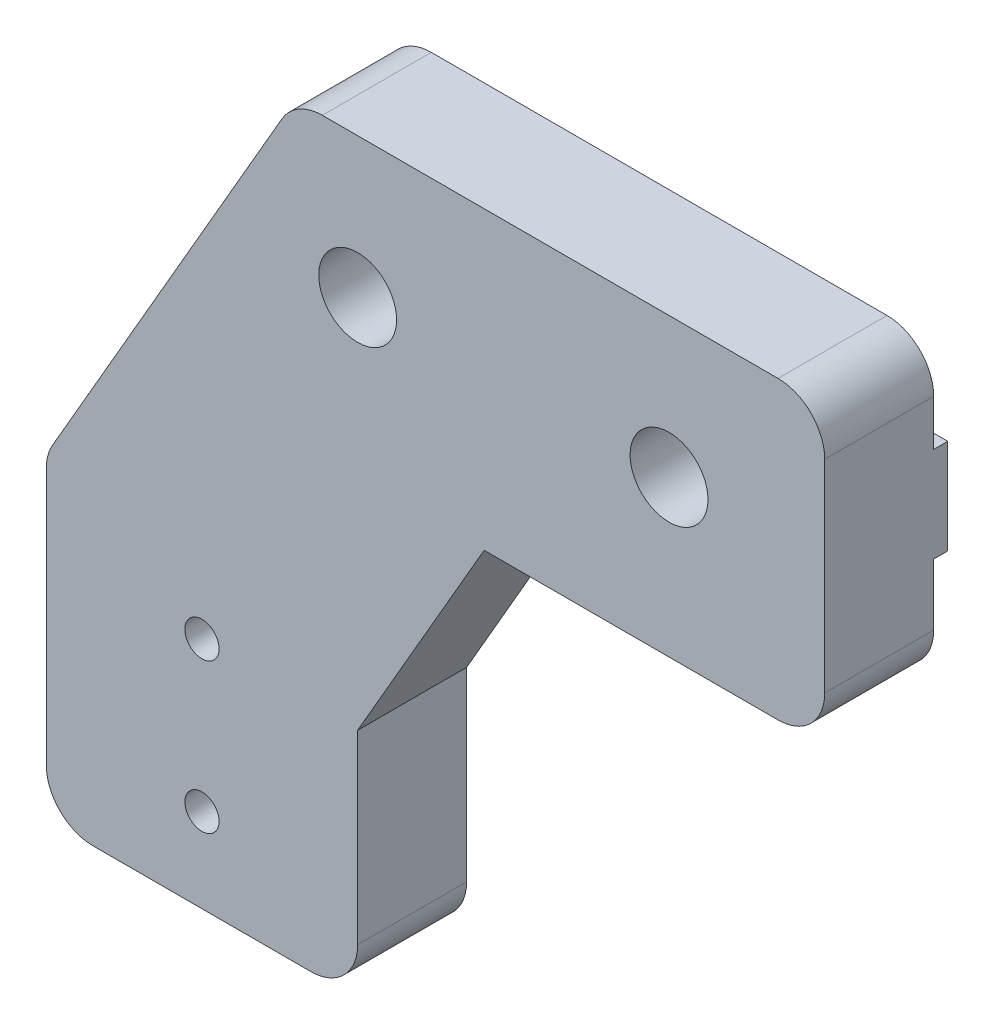
ISO-10303-21;
HEADER;
FILE_DESCRIPTION(('STEP AP214'),'2;1');
FILE_NAME('part.step','',(''),(''),'','','');
FILE_SCHEMA(('AUTOMOTIVE_DESIGN { 1 0 10303 214 1 1 1 1 }'));
ENDSEC;
DATA;
#1=APPLICATION_CONTEXT('core data for automotive mechanical design processes');
#2=APPLICATION_PROTOCOL_DEFINITION('international standard','automotive_design',2000,#1);
#3=PRODUCT_CONTEXT('',#1,'mechanical');
#4=PRODUCT('Part','Part','',(#3));
#5=PRODUCT_RELATED_PRODUCT_CATEGORY('part','',(#4));
#6=PRODUCT_DEFINITION_FORMATION('','',#4);
#7=PRODUCT_DEFINITION_CONTEXT('part definition',#1,'design');
#8=PRODUCT_DEFINITION('design','',#6,#7);
#9=PRODUCT_DEFINITION_SHAPE('','',#8);
#10=(LENGTH_UNIT() NAMED_UNIT(*) SI_UNIT(.MILLI.,.METRE.));
#11=(NAMED_UNIT(*) PLANE_ANGLE_UNIT() SI_UNIT($,.RADIAN.));
#12=(NAMED_UNIT(*) SI_UNIT($,.STERADIAN.) SOLID_ANGLE_UNIT());
#13=UNCERTAINTY_MEASURE_WITH_UNIT(LENGTH_MEASURE(1.E-05),#10,'distance_accuracy_value','');
#14=(GEOMETRIC_REPRESENTATION_CONTEXT(3) GLOBAL_UNCERTAINTY_ASSIGNED_CONTEXT((#13)) GLOBAL_UNIT_ASSIGNED_CONTEXT((#10,
#11,#12)) REPRESENTATION_CONTEXT('',''));
#15=CARTESIAN_POINT('',(0.,0.,0.));
#16=DIRECTION('',(0.,0.,1.));
#17=DIRECTION('',(1.,0.,0.));
#18=AXIS2_PLACEMENT_3D('',#15,#16,#17);
#19=CARTESIAN_POINT('',(3.,19.4833395016044,0.));
#20=DIRECTION('',(0.,0.,-1.));
#21=DIRECTION('',(-1.,0.,0.));
#22=AXIS2_PLACEMENT_3D('',#19,#20,#21);
#23=PLANE('',#22);
#24=CARTESIAN_POINT('',(10.,5.4,0.));
#25=DIRECTION('',(0.,0.,1.));
#26=DIRECTION('',(1.,0.,0.));
#27=AXIS2_PLACEMENT_3D('',#24,#25,#26);
#28=CIRCLE('',#27,1.1);
#29=CARTESIAN_POINT('',(11.1,5.4,0.));
#30=VERTEX_POINT('',#29);
#31=EDGE_CURVE('E198',#30,#30,#28,.T.);
#32=ORIENTED_EDGE('',*,*,#31,.T.);
#33=EDGE_LOOP('',(#32));
#34=FACE_BOUND('',#33,.T.);
#35=CARTESIAN_POINT('',(10.,15.,0.));
#36=DIRECTION('',(0.,0.,1.));
#37=DIRECTION('',(1.,0.,0.));
#38=AXIS2_PLACEMENT_3D('',#35,#36,#37);
#39=CIRCLE('',#38,1.1);
#40=CARTESIAN_POINT('',(11.1,15.,0.));
#41=VERTEX_POINT('',#40);
#42=EDGE_CURVE('E199',#41,#41,#39,.T.);
#43=ORIENTED_EDGE('',*,*,#42,.T.);
#44=EDGE_LOOP('',(#43));
#45=FACE_BOUND('',#44,.T.);
#46=DIRECTION('',(-0.499999999999998,-0.86602540378444,0.));
#47=VECTOR('',#46,1.);
#48=CARTESIAN_POINT('',(15.1339745962156,46.5,0.));
#49=LINE('',#48,#47);
#50=CARTESIAN_POINT('',(9.04292925626505,35.95,0.));
#51=VERTEX_POINT('',#50);
#52=CARTESIAN_POINT('',(0.401923788646674,20.9833395016044,0.));
#53=VERTEX_POINT('',#52);
#54=EDGE_CURVE('E55',#51,#53,#49,.T.);
#55=ORIENTED_EDGE('',*,*,#54,.F.);
#56=DIRECTION('',(1.,0.,0.));
#57=VECTOR('',#56,1.);
#58=CARTESIAN_POINT('',(4.16086702878034,35.95,0.));
#59=LINE('',#58,#57);
#60=CARTESIAN_POINT('',(50.,35.95,0.));
#61=VERTEX_POINT('',#60);
#62=EDGE_CURVE('E50',#51,#61,#59,.T.);
#63=ORIENTED_EDGE('',*,*,#62,.T.);
#64=DIRECTION('',(0.,1.,0.));
#65=VECTOR('',#64,1.);
#66=CARTESIAN_POINT('',(50.,32.,0.));
#67=LINE('',#66,#65);
#68=CARTESIAN_POINT('',(50.,32.,0.));
#69=VERTEX_POINT('',#68);
#70=EDGE_CURVE('E182',#69,#61,#67,.T.);
#71=ORIENTED_EDGE('',*,*,#70,.F.);
#72=CARTESIAN_POINT('',(47.,32.,0.));
#73=DIRECTION('',(0.,0.,1.));
#74=DIRECTION('',(1.,0.,0.));
#75=AXIS2_PLACEMENT_3D('',#72,#73,#74);
#76=CIRCLE('',#75,3.);
#77=CARTESIAN_POINT('',(47.,29.,0.));
#78=VERTEX_POINT('',#77);
#79=EDGE_CURVE('E261',#78,#69,#76,.T.);
#80=ORIENTED_EDGE('',*,*,#79,.F.);
#81=DIRECTION('',(1.,0.,0.));
#82=VECTOR('',#81,1.);
#83=CARTESIAN_POINT('',(28.1243556529822,29.,0.));
#84=LINE('',#83,#82);
#85=CARTESIAN_POINT('',(28.1243556529822,29.,0.));
#86=VERTEX_POINT('',#85);
#87=EDGE_CURVE('E259',#86,#78,#84,.T.);
#88=ORIENTED_EDGE('',*,*,#87,.F.);
#89=DIRECTION('',(0.499999999999998,0.86602540378444,0.));
#90=VECTOR('',#89,1.);
#91=CARTESIAN_POINT('',(20.,14.9282032302754,0.));
#92=LINE('',#91,#90);
#93=CARTESIAN_POINT('',(20.,14.9282032302754,0.));
#94=VERTEX_POINT('',#93);
#95=EDGE_CURVE('E257',#94,#86,#92,.T.);
#96=ORIENTED_EDGE('',*,*,#95,.F.);
#97=DIRECTION('',(0.,1.,0.));
#98=VECTOR('',#97,1.);
#99=CARTESIAN_POINT('',(20.,3.00000000000002,0.));
#100=LINE('',#99,#98);
#101=CARTESIAN_POINT('',(20.,3.00000000000002,0.));
#102=VERTEX_POINT('',#101);
#103=EDGE_CURVE('E255',#102,#94,#100,.T.);
#104=ORIENTED_EDGE('',*,*,#103,.F.);
#105=CARTESIAN_POINT('',(17.,3.,0.));
#106=DIRECTION('',(0.,0.,1.));
#107=DIRECTION('',(1.,0.,0.));
#108=AXIS2_PLACEMENT_3D('',#105,#106,#107);
#109=CIRCLE('',#108,3.);
#110=CARTESIAN_POINT('',(17.,0.,0.));
#111=VERTEX_POINT('',#110);
#112=EDGE_CURVE('E253',#111,#102,#109,.T.);
#113=ORIENTED_EDGE('',*,*,#112,.F.);
#114=DIRECTION('',(1.,0.,0.));
#115=VECTOR('',#114,1.);
#116=CARTESIAN_POINT('',(3.00000000000002,0.,0.));
#117=LINE('',#116,#115);
#118=CARTESIAN_POINT('',(3.00000000000002,0.,0.));
#119=VERTEX_POINT('',#118);
#120=EDGE_CURVE('E251',#119,#111,#117,.T.);
#121=ORIENTED_EDGE('',*,*,#120,.F.);
#122=CARTESIAN_POINT('',(3.,3.,0.));
#123=DIRECTION('',(0.,0.,1.));
#124=DIRECTION('',(1.,0.,0.));
#125=AXIS2_PLACEMENT_3D('',#122,#123,#124);
#126=CIRCLE('',#125,3.);
#127=CARTESIAN_POINT('',(0.,3.00000000000002,0.));
#128=VERTEX_POINT('',#127);
#129=EDGE_CURVE('E249',#128,#119,#126,.T.);
#130=ORIENTED_EDGE('',*,*,#129,.F.);
#131=DIRECTION('',(0.,-1.,0.));
#132=VECTOR('',#131,1.);
#133=CARTESIAN_POINT('',(0.,19.4833395016044,0.));
#134=LINE('',#133,#132);
#135=CARTESIAN_POINT('',(0.,19.4833395016044,0.));
#136=VERTEX_POINT('',#135);
#137=EDGE_CURVE('E247',#136,#128,#134,.T.);
#138=ORIENTED_EDGE('',*,*,#137,.F.);
#139=CARTESIAN_POINT('',(3.,19.4833395016044,0.));
#140=DIRECTION('',(0.,0.,1.));
#141=DIRECTION('',(-1.,0.,0.));
#142=AXIS2_PLACEMENT_3D('',#139,#140,#141);
#143=CIRCLE('',#142,3.);
#144=EDGE_CURVE('E213',#53,#136,#143,.T.);
#145=ORIENTED_EDGE('',*,*,#144,.F.);
#146=EDGE_LOOP('',(#55,#63,#71,#80,#88,#96,#104,#113,#121,#130,#138,#145));
#147=FACE_BOUND('',#146,.T.);
#148=ADVANCED_FACE('F33',(#34,#45,#147),#23,.T.);
#149=CARTESIAN_POINT('',(3.,19.4833395016044,7.));
#150=DIRECTION('',(0.,0.,-1.));
#151=DIRECTION('',(-1.,0.,0.));
#152=AXIS2_PLACEMENT_3D('',#149,#150,#151);
#153=PLANE('',#152);
#154=CARTESIAN_POINT('',(10.,5.4,7.));
#155=DIRECTION('',(0.,0.,1.));
#156=DIRECTION('',(1.,0.,0.));
#157=AXIS2_PLACEMENT_3D('',#154,#155,#156);
#158=CIRCLE('',#157,1.1);
#159=CARTESIAN_POINT('',(11.1,5.4,7.));
#160=VERTEX_POINT('',#159);
#161=EDGE_CURVE('E202',#160,#160,#158,.T.);
#162=ORIENTED_EDGE('',*,*,#161,.F.);
#163=EDGE_LOOP('',(#162));
#164=FACE_BOUND('',#163,.T.);
#165=CARTESIAN_POINT('',(20.,39.,7.));
#166=DIRECTION('',(0.,0.,1.));
#167=DIRECTION('',(1.,0.,0.));
#168=AXIS2_PLACEMENT_3D('',#165,#166,#167);
#169=CIRCLE('',#168,2.5);
#170=CARTESIAN_POINT('',(22.5,39.,7.));
#171=VERTEX_POINT('',#170);
#172=EDGE_CURVE('E210',#171,#171,#169,.T.);
#173=ORIENTED_EDGE('',*,*,#172,.F.);
#174=EDGE_LOOP('',(#173));
#175=FACE_BOUND('',#174,.T.);
#176=CARTESIAN_POINT('',(3.,19.4833395016044,7.));
#177=DIRECTION('',(0.,0.,1.));
#178=DIRECTION('',(-1.,0.,0.));
#179=AXIS2_PLACEMENT_3D('',#176,#177,#178);
#180=CIRCLE('',#179,3.);
#181=CARTESIAN_POINT('',(0.401923788646674,20.9833395016044,7.));
#182=VERTEX_POINT('',#181);
#183=CARTESIAN_POINT('',(0.,19.4833395016044,7.));
#184=VERTEX_POINT('',#183);
#185=EDGE_CURVE('E214',#182,#184,#180,.T.);
#186=ORIENTED_EDGE('',*,*,#185,.T.);
#187=DIRECTION('',(0.,-1.,0.));
#188=VECTOR('',#187,1.);
#189=CARTESIAN_POINT('',(0.,19.4833395016044,7.));
#190=LINE('',#189,#188);
#191=CARTESIAN_POINT('',(0.,3.00000000000002,7.));
#192=VERTEX_POINT('',#191);
#193=EDGE_CURVE('E217',#184,#192,#190,.T.);
#194=ORIENTED_EDGE('',*,*,#193,.T.);
#195=CARTESIAN_POINT('',(3.,3.,7.));
#196=DIRECTION('',(0.,0.,1.));
#197=DIRECTION('',(1.,0.,0.));
#198=AXIS2_PLACEMENT_3D('',#195,#196,#197);
#199=CIRCLE('',#198,3.);
#200=CARTESIAN_POINT('',(3.00000000000002,0.,7.));
#201=VERTEX_POINT('',#200);
#202=EDGE_CURVE('E220',#192,#201,#199,.T.);
#203=ORIENTED_EDGE('',*,*,#202,.T.);
#204=DIRECTION('',(1.,0.,0.));
#205=VECTOR('',#204,1.);
#206=CARTESIAN_POINT('',(3.00000000000002,0.,7.));
#207=LINE('',#206,#205);
#208=CARTESIAN_POINT('',(17.,0.,7.));
#209=VERTEX_POINT('',#208);
#210=EDGE_CURVE('E222',#201,#209,#207,.T.);
#211=ORIENTED_EDGE('',*,*,#210,.T.);
#212=CARTESIAN_POINT('',(17.,3.,7.));
#213=DIRECTION('',(0.,0.,1.));
#214=DIRECTION('',(1.,0.,0.));
#215=AXIS2_PLACEMENT_3D('',#212,#213,#214);
#216=CIRCLE('',#215,3.);
#217=CARTESIAN_POINT('',(20.,3.00000000000002,7.));
#218=VERTEX_POINT('',#217);
#219=EDGE_CURVE('E224',#209,#218,#216,.T.);
#220=ORIENTED_EDGE('',*,*,#219,.T.);
#221=DIRECTION('',(0.,1.,0.));
#222=VECTOR('',#221,1.);
#223=CARTESIAN_POINT('',(20.,3.00000000000002,7.));
#224=LINE('',#223,#222);
#225=CARTESIAN_POINT('',(20.,14.9282032302754,7.));
#226=VERTEX_POINT('',#225);
#227=EDGE_CURVE('E226',#218,#226,#224,.T.);
#228=ORIENTED_EDGE('',*,*,#227,.T.);
#229=DIRECTION('',(0.499999999999998,0.86602540378444,0.));
#230=VECTOR('',#229,1.);
#231=CARTESIAN_POINT('',(20.,14.9282032302754,7.));
#232=LINE('',#231,#230);
#233=CARTESIAN_POINT('',(28.1243556529822,29.,7.));
#234=VERTEX_POINT('',#233);
#235=EDGE_CURVE('E228',#226,#234,#232,.T.);
#236=ORIENTED_EDGE('',*,*,#235,.T.);
#237=DIRECTION('',(1.,0.,0.));
#238=VECTOR('',#237,1.);
#239=CARTESIAN_POINT('',(28.1243556529822,29.,7.));
#240=LINE('',#239,#238);
#241=CARTESIAN_POINT('',(47.,29.,7.));
#242=VERTEX_POINT('',#241);
#243=EDGE_CURVE('E230',#234,#242,#240,.T.);
#244=ORIENTED_EDGE('',*,*,#243,.T.);
#245=CARTESIAN_POINT('',(47.,32.,7.));
#246=DIRECTION('',(0.,0.,1.));
#247=DIRECTION('',(1.,0.,0.));
#248=AXIS2_PLACEMENT_3D('',#245,#246,#247);
#249=CIRCLE('',#248,3.);
#250=CARTESIAN_POINT('',(50.,32.,7.));
#251=VERTEX_POINT('',#250);
#252=EDGE_CURVE('E232',#242,#251,#249,.T.);
#253=ORIENTED_EDGE('',*,*,#252,.T.);
#254=DIRECTION('',(0.,1.,0.));
#255=VECTOR('',#254,1.);
#256=CARTESIAN_POINT('',(50.,32.,7.));
#257=LINE('',#256,#255);
#258=CARTESIAN_POINT('',(50.,45.,7.));
#259=VERTEX_POINT('',#258);
#260=EDGE_CURVE('E234',#251,#259,#257,.T.);
#261=ORIENTED_EDGE('',*,*,#260,.T.);
#262=CARTESIAN_POINT('',(47.,45.,7.));
#263=DIRECTION('',(0.,0.,1.));
#264=DIRECTION('',(1.,0.,0.));
#265=AXIS2_PLACEMENT_3D('',#262,#263,#264);
#266=CIRCLE('',#265,3.);
#267=CARTESIAN_POINT('',(47.,48.,7.));
#268=VERTEX_POINT('',#267);
#269=EDGE_CURVE('E236',#259,#268,#266,.T.);
#270=ORIENTED_EDGE('',*,*,#269,.T.);
#271=DIRECTION('',(-1.,0.,0.));
#272=VECTOR('',#271,1.);
#273=CARTESIAN_POINT('',(47.,48.,7.));
#274=LINE('',#273,#272);
#275=CARTESIAN_POINT('',(17.7320508075689,48.,7.));
#276=VERTEX_POINT('',#275);
#277=EDGE_CURVE('E238',#268,#276,#274,.T.);
#278=ORIENTED_EDGE('',*,*,#277,.T.);
#279=CARTESIAN_POINT('',(17.7320508075689,45.,7.));
#280=DIRECTION('',(0.,0.,1.));
#281=DIRECTION('',(-1.,0.,0.));
#282=AXIS2_PLACEMENT_3D('',#279,#280,#281);
#283=CIRCLE('',#282,3.);
#284=CARTESIAN_POINT('',(15.1339745962156,46.5,7.));
#285=VERTEX_POINT('',#284);
#286=EDGE_CURVE('E240',#276,#285,#283,.T.);
#287=ORIENTED_EDGE('',*,*,#286,.T.);
#288=DIRECTION('',(-0.499999999999998,-0.86602540378444,0.));
#289=VECTOR('',#288,1.);
#290=CARTESIAN_POINT('',(15.1339745962156,46.5,7.));
#291=LINE('',#290,#289);
#292=EDGE_CURVE('E242',#285,#182,#291,.T.);
#293=ORIENTED_EDGE('',*,*,#292,.T.);
#294=EDGE_LOOP('',(#186,#194,#203,#211,#220,#228,#236,#244,#253,#261,#270,#278,#287,#293));
#295=FACE_BOUND('',#294,.T.);
#296=CARTESIAN_POINT('',(40.,39.,7.));
#297=DIRECTION('',(0.,0.,1.));
#298=DIRECTION('',(1.,0.,0.));
#299=AXIS2_PLACEMENT_3D('',#296,#297,#298);
#300=CIRCLE('',#299,2.5);
#301=CARTESIAN_POINT('',(42.5,39.,7.));
#302=VERTEX_POINT('',#301);
#303=EDGE_CURVE('E205',#302,#302,#300,.T.);
#304=ORIENTED_EDGE('',*,*,#303,.F.);
#305=EDGE_LOOP('',(#304));
#306=FACE_BOUND('',#305,.T.);
#307=CARTESIAN_POINT('',(10.,15.,7.));
#308=DIRECTION('',(0.,0.,1.));
#309=DIRECTION('',(1.,0.,0.));
#310=AXIS2_PLACEMENT_3D('',#307,#308,#309);
#311=CIRCLE('',#310,1.1);
#312=CARTESIAN_POINT('',(11.1,15.,7.));
#313=VERTEX_POINT('',#312);
#314=EDGE_CURVE('E195',#313,#313,#311,.T.);
#315=ORIENTED_EDGE('',*,*,#314,.F.);
#316=EDGE_LOOP('',(#315));
#317=FACE_BOUND('',#316,.T.);
#318=ADVANCED_FACE('F335',(#164,#175,#295,#306,#317),#153,.F.);
#319=DIRECTION('',(1.,0.,0.));
#320=VECTOR('',#319,1.);
#321=CARTESIAN_POINT('',(4.16086702878034,42.05,0.));
#322=LINE('',#321,#320);
#323=CARTESIAN_POINT('',(12.5647658983217,42.05,0.));
#324=VERTEX_POINT('',#323);
#325=CARTESIAN_POINT('',(50.,42.05,0.));
#326=VERTEX_POINT('',#325);
#327=EDGE_CURVE('E356',#324,#326,#322,.T.);
#328=ORIENTED_EDGE('',*,*,#327,.F.);
#329=CARTESIAN_POINT('',(15.1339745962156,46.5,0.));
#330=VERTEX_POINT('',#329);
#331=EDGE_CURVE('E218',#330,#324,#49,.T.);
#332=ORIENTED_EDGE('',*,*,#331,.F.);
#333=CARTESIAN_POINT('',(17.7320508075689,45.,0.));
#334=DIRECTION('',(0.,0.,1.));
#335=DIRECTION('',(-1.,0.,0.));
#336=AXIS2_PLACEMENT_3D('',#333,#334,#335);
#337=CIRCLE('',#336,3.);
#338=CARTESIAN_POINT('',(17.7320508075689,48.,0.));
#339=VERTEX_POINT('',#338);
#340=EDGE_CURVE('E275',#339,#330,#337,.T.);
#341=ORIENTED_EDGE('',*,*,#340,.F.);
#342=DIRECTION('',(-1.,0.,0.));
#343=VECTOR('',#342,1.);
#344=CARTESIAN_POINT('',(47.,48.,0.));
#345=LINE('',#344,#343);
#346=CARTESIAN_POINT('',(47.,48.,0.));
#347=VERTEX_POINT('',#346);
#348=EDGE_CURVE('E413',#347,#339,#345,.T.);
#349=ORIENTED_EDGE('',*,*,#348,.F.);
#350=CARTESIAN_POINT('',(47.,45.,0.));
#351=DIRECTION('',(0.,0.,1.));
#352=DIRECTION('',(1.,0.,0.));
#353=AXIS2_PLACEMENT_3D('',#350,#351,#352);
#354=CIRCLE('',#353,3.);
#355=CARTESIAN_POINT('',(50.,45.,0.));
#356=VERTEX_POINT('',#355);
#357=EDGE_CURVE('E266',#356,#347,#354,.T.);
#358=ORIENTED_EDGE('',*,*,#357,.F.);
#359=EDGE_CURVE('E263',#326,#356,#67,.T.);
#360=ORIENTED_EDGE('',*,*,#359,.F.);
#361=EDGE_LOOP('',(#328,#332,#341,#349,#358,#360));
#362=FACE_BOUND('',#361,.T.);
#363=ADVANCED_FACE('F390',(#362),#23,.T.);
#364=CARTESIAN_POINT('',(3.,19.4833395016044,7.));
#365=DIRECTION('',(0.,0.,-1.));
#366=DIRECTION('',(-1.,0.,0.));
#367=AXIS2_PLACEMENT_3D('',#364,#365,#366);
#368=CYLINDRICAL_SURFACE('',#367,3.);
#369=ORIENTED_EDGE('',*,*,#144,.T.);
#370=DIRECTION('',(0.,0.,-1.));
#371=VECTOR('',#370,1.);
#372=CARTESIAN_POINT('',(0.,19.4833395016044,7.));
#373=LINE('',#372,#371);
#374=EDGE_CURVE('E11',#184,#136,#373,.T.);
#375=ORIENTED_EDGE('',*,*,#374,.F.);
#376=ORIENTED_EDGE('',*,*,#185,.F.);
#377=DIRECTION('',(0.,0.,-1.));
#378=VECTOR('',#377,1.);
#379=CARTESIAN_POINT('',(0.401923788646674,20.9833395016044,7.));
#380=LINE('',#379,#378);
#381=EDGE_CURVE('E244',#182,#53,#380,.T.);
#382=ORIENTED_EDGE('',*,*,#381,.T.);
#383=EDGE_LOOP('',(#369,#375,#376,#382));
#384=FACE_BOUND('',#383,.T.);
#385=ADVANCED_FACE('F35',(#384),#368,.T.);
#386=CARTESIAN_POINT('',(0.,19.4833395016044,7.));
#387=DIRECTION('',(1.,0.,0.));
#388=DIRECTION('',(0.,0.,-1.));
#389=AXIS2_PLACEMENT_3D('',#386,#387,#388);
#390=PLANE('',#389);
#391=ORIENTED_EDGE('',*,*,#137,.T.);
#392=DIRECTION('',(0.,0.,-1.));
#393=VECTOR('',#392,1.);
#394=CARTESIAN_POINT('',(0.,3.00000000000002,7.));
#395=LINE('',#394,#393);
#396=EDGE_CURVE('E42',#192,#128,#395,.T.);
#397=ORIENTED_EDGE('',*,*,#396,.F.);
#398=ORIENTED_EDGE('',*,*,#193,.F.);
#399=ORIENTED_EDGE('',*,*,#374,.T.);
#400=EDGE_LOOP('',(#391,#397,#398,#399));
#401=FACE_BOUND('',#400,.T.);
#402=ADVANCED_FACE('F340',(#401),#390,.F.);
#403=CARTESIAN_POINT('',(3.,3.,7.));
#404=DIRECTION('',(0.,0.,-1.));
#405=DIRECTION('',(-1.,0.,0.));
#406=AXIS2_PLACEMENT_3D('',#403,#404,#405);
#407=CYLINDRICAL_SURFACE('',#406,3.);
#408=ORIENTED_EDGE('',*,*,#129,.T.);
#409=DIRECTION('',(0.,0.,-1.));
#410=VECTOR('',#409,1.);
#411=CARTESIAN_POINT('',(3.00000000000002,0.,7.));
#412=LINE('',#411,#410);
#413=EDGE_CURVE('E311',#201,#119,#412,.T.);
#414=ORIENTED_EDGE('',*,*,#413,.F.);
#415=ORIENTED_EDGE('',*,*,#202,.F.);
#416=ORIENTED_EDGE('',*,*,#396,.T.);
#417=EDGE_LOOP('',(#408,#414,#415,#416));
#418=FACE_BOUND('',#417,.T.);
#419=ADVANCED_FACE('F319',(#418),#407,.T.);
#420=CARTESIAN_POINT('',(3.00000000000002,0.,7.));
#421=DIRECTION('',(0.,1.,0.));
#422=DIRECTION('',(0.,0.,1.));
#423=AXIS2_PLACEMENT_3D('',#420,#421,#422);
#424=PLANE('',#423);
#425=ORIENTED_EDGE('',*,*,#120,.T.);
#426=DIRECTION('',(0.,0.,-1.));
#427=VECTOR('',#426,1.);
#428=CARTESIAN_POINT('',(17.,0.,7.));
#429=LINE('',#428,#427);
#430=EDGE_CURVE('E308',#209,#111,#429,.T.);
#431=ORIENTED_EDGE('',*,*,#430,.F.);
#432=ORIENTED_EDGE('',*,*,#210,.F.);
#433=ORIENTED_EDGE('',*,*,#413,.T.);
#434=EDGE_LOOP('',(#425,#431,#432,#433));
#435=FACE_BOUND('',#434,.T.);
#436=ADVANCED_FACE('F327',(#435),#424,.F.);
#437=CARTESIAN_POINT('',(17.,3.,7.));
#438=DIRECTION('',(0.,0.,-1.));
#439=DIRECTION('',(-1.,0.,0.));
#440=AXIS2_PLACEMENT_3D('',#437,#438,#439);
#441=CYLINDRICAL_SURFACE('',#440,3.);
#442=ORIENTED_EDGE('',*,*,#112,.T.);
#443=DIRECTION('',(0.,0.,-1.));
#444=VECTOR('',#443,1.);
#445=CARTESIAN_POINT('',(20.,3.00000000000002,7.));
#446=LINE('',#445,#444);
#447=EDGE_CURVE('E305',#218,#102,#446,.T.);
#448=ORIENTED_EDGE('',*,*,#447,.F.);
#449=ORIENTED_EDGE('',*,*,#219,.F.);
#450=ORIENTED_EDGE('',*,*,#430,.T.);
#451=EDGE_LOOP('',(#442,#448,#449,#450));
#452=FACE_BOUND('',#451,.T.);
#453=ADVANCED_FACE('F331',(#452),#441,.T.);
#454=CARTESIAN_POINT('',(20.,3.00000000000002,7.));
#455=DIRECTION('',(-1.,0.,0.));
#456=DIRECTION('',(0.,0.,1.));
#457=AXIS2_PLACEMENT_3D('',#454,#455,#456);
#458=PLANE('',#457);
#459=ORIENTED_EDGE('',*,*,#103,.T.);
#460=DIRECTION('',(0.,0.,-1.));
#461=VECTOR('',#460,1.);
#462=CARTESIAN_POINT('',(20.,14.9282032302754,7.));
#463=LINE('',#462,#461);
#464=EDGE_CURVE('E302',#226,#94,#463,.T.);
#465=ORIENTED_EDGE('',*,*,#464,.F.);
#466=ORIENTED_EDGE('',*,*,#227,.F.);
#467=ORIENTED_EDGE('',*,*,#447,.T.);
#468=EDGE_LOOP('',(#459,#465,#466,#467));
#469=FACE_BOUND('',#468,.T.);
#470=ADVANCED_FACE('F436',(#469),#458,.F.);
#471=CARTESIAN_POINT('',(20.,14.9282032302754,7.));
#472=DIRECTION('',(-0.86602540378444,0.499999999999998,0.));
#473=DIRECTION('',(-0.499999999999998,-0.86602540378444,0.));
#474=AXIS2_PLACEMENT_3D('',#471,#472,#473);
#475=PLANE('',#474);
#476=ORIENTED_EDGE('',*,*,#95,.T.);
#477=DIRECTION('',(0.,0.,-1.));
#478=VECTOR('',#477,1.);
#479=CARTESIAN_POINT('',(28.1243556529822,29.,7.));
#480=LINE('',#479,#478);
#481=EDGE_CURVE('E299',#234,#86,#480,.T.);
#482=ORIENTED_EDGE('',*,*,#481,.F.);
#483=ORIENTED_EDGE('',*,*,#235,.F.);
#484=ORIENTED_EDGE('',*,*,#464,.T.);
#485=EDGE_LOOP('',(#476,#482,#483,#484));
#486=FACE_BOUND('',#485,.T.);
#487=ADVANCED_FACE('F434',(#486),#475,.F.);
#488=CARTESIAN_POINT('',(28.1243556529822,29.,7.));
#489=DIRECTION('',(0.,1.,0.));
#490=DIRECTION('',(-1.,0.,0.));
#491=AXIS2_PLACEMENT_3D('',#488,#489,#490);
#492=PLANE('',#491);
#493=ORIENTED_EDGE('',*,*,#87,.T.);
#494=DIRECTION('',(0.,0.,-1.));
#495=VECTOR('',#494,1.);
#496=CARTESIAN_POINT('',(47.,29.,7.));
#497=LINE('',#496,#495);
#498=EDGE_CURVE('E296',#242,#78,#497,.T.);
#499=ORIENTED_EDGE('',*,*,#498,.F.);
#500=ORIENTED_EDGE('',*,*,#243,.F.);
#501=ORIENTED_EDGE('',*,*,#481,.T.);
#502=EDGE_LOOP('',(#493,#499,#500,#501));
#503=FACE_BOUND('',#502,.T.);
#504=ADVANCED_FACE('F430',(#503),#492,.F.);
#505=CARTESIAN_POINT('',(47.,32.,7.));
#506=DIRECTION('',(0.,0.,-1.));
#507=DIRECTION('',(-1.,0.,0.));
#508=AXIS2_PLACEMENT_3D('',#505,#506,#507);
#509=CYLINDRICAL_SURFACE('',#508,3.);
#510=ORIENTED_EDGE('',*,*,#79,.T.);
#511=DIRECTION('',(0.,0.,-1.));
#512=VECTOR('',#511,1.);
#513=CARTESIAN_POINT('',(50.,32.,7.));
#514=LINE('',#513,#512);
#515=EDGE_CURVE('E294',#251,#69,#514,.T.);
#516=ORIENTED_EDGE('',*,*,#515,.F.);
#517=ORIENTED_EDGE('',*,*,#252,.F.);
#518=ORIENTED_EDGE('',*,*,#498,.T.);
#519=EDGE_LOOP('',(#510,#516,#517,#518));
#520=FACE_BOUND('',#519,.T.);
#521=ADVANCED_FACE('F426',(#520),#509,.T.);
#522=CARTESIAN_POINT('',(50.,32.,7.));
#523=DIRECTION('',(-1.,0.,0.));
#524=DIRECTION('',(0.,0.,1.));
#525=AXIS2_PLACEMENT_3D('',#522,#523,#524);
#526=PLANE('',#525);
#527=ORIENTED_EDGE('',*,*,#70,.T.);
#528=DIRECTION('',(0.,0.,-1.));
#529=VECTOR('',#528,1.);
#530=CARTESIAN_POINT('',(50.,35.95,0.));
#531=LINE('',#530,#529);
#532=CARTESIAN_POINT('',(50.,35.95,-0.900000000000001));
#533=VERTEX_POINT('',#532);
#534=EDGE_CURVE('E165',#61,#533,#531,.T.);
#535=ORIENTED_EDGE('',*,*,#534,.T.);
#536=DIRECTION('',(0.,-1.,0.));
#537=VECTOR('',#536,1.);
#538=CARTESIAN_POINT('',(50.,42.05,-0.9));
#539=LINE('',#538,#537);
#540=CARTESIAN_POINT('',(50.,42.05,-0.9));
#541=VERTEX_POINT('',#540);
#542=EDGE_CURVE('E172',#541,#533,#539,.T.);
#543=ORIENTED_EDGE('',*,*,#542,.F.);
#544=DIRECTION('',(0.,0.,-1.));
#545=VECTOR('',#544,1.);
#546=CARTESIAN_POINT('',(50.,42.05,0.));
#547=LINE('',#546,#545);
#548=EDGE_CURVE('E178',#326,#541,#547,.T.);
#549=ORIENTED_EDGE('',*,*,#548,.F.);
#550=ORIENTED_EDGE('',*,*,#359,.T.);
#551=DIRECTION('',(0.,0.,-1.));
#552=VECTOR('',#551,1.);
#553=CARTESIAN_POINT('',(50.,45.,7.));
#554=LINE('',#553,#552);
#555=EDGE_CURVE('E291',#259,#356,#554,.T.);
#556=ORIENTED_EDGE('',*,*,#555,.F.);
#557=ORIENTED_EDGE('',*,*,#260,.F.);
#558=ORIENTED_EDGE('',*,*,#515,.T.);
#559=EDGE_LOOP('',(#527,#535,#543,#549,#550,#556,#557,#558));
#560=FACE_BOUND('',#559,.T.);
#561=ADVANCED_FACE('F180',(#560),#526,.F.);
#562=CARTESIAN_POINT('',(47.,45.,7.));
#563=DIRECTION('',(0.,0.,-1.));
#564=DIRECTION('',(-1.,0.,0.));
#565=AXIS2_PLACEMENT_3D('',#562,#563,#564);
#566=CYLINDRICAL_SURFACE('',#565,3.);
#567=ORIENTED_EDGE('',*,*,#357,.T.);
#568=DIRECTION('',(0.,0.,-1.));
#569=VECTOR('',#568,1.);
#570=CARTESIAN_POINT('',(47.,48.,7.));
#571=LINE('',#570,#569);
#572=EDGE_CURVE('E288',#268,#347,#571,.T.);
#573=ORIENTED_EDGE('',*,*,#572,.F.);
#574=ORIENTED_EDGE('',*,*,#269,.F.);
#575=ORIENTED_EDGE('',*,*,#555,.T.);
#576=EDGE_LOOP('',(#567,#573,#574,#575));
#577=FACE_BOUND('',#576,.T.);
#578=ADVANCED_FACE('F410',(#577),#566,.T.);
#579=CARTESIAN_POINT('',(47.,48.,7.));
#580=DIRECTION('',(0.,-1.,0.));
#581=DIRECTION('',(1.,0.,0.));
#582=AXIS2_PLACEMENT_3D('',#579,#580,#581);
#583=PLANE('',#582);
#584=ORIENTED_EDGE('',*,*,#348,.T.);
#585=DIRECTION('',(0.,0.,-1.));
#586=VECTOR('',#585,1.);
#587=CARTESIAN_POINT('',(17.7320508075689,48.,7.));
#588=LINE('',#587,#586);
#589=EDGE_CURVE('E285',#276,#339,#588,.T.);
#590=ORIENTED_EDGE('',*,*,#589,.F.);
#591=ORIENTED_EDGE('',*,*,#277,.F.);
#592=ORIENTED_EDGE('',*,*,#572,.T.);
#593=EDGE_LOOP('',(#584,#590,#591,#592));
#594=FACE_BOUND('',#593,.T.);
#595=ADVANCED_FACE('F419',(#594),#583,.F.);
#596=CARTESIAN_POINT('',(17.7320508075689,45.,7.));
#597=DIRECTION('',(0.,0.,-1.));
#598=DIRECTION('',(-1.,0.,0.));
#599=AXIS2_PLACEMENT_3D('',#596,#597,#598);
#600=CYLINDRICAL_SURFACE('',#599,3.);
#601=ORIENTED_EDGE('',*,*,#340,.T.);
#602=DIRECTION('',(0.,0.,-1.));
#603=VECTOR('',#602,1.);
#604=CARTESIAN_POINT('',(15.1339745962156,46.5,7.));
#605=LINE('',#604,#603);
#606=EDGE_CURVE('E282',#285,#330,#605,.T.);
#607=ORIENTED_EDGE('',*,*,#606,.F.);
#608=ORIENTED_EDGE('',*,*,#286,.F.);
#609=ORIENTED_EDGE('',*,*,#589,.T.);
#610=EDGE_LOOP('',(#601,#607,#608,#609));
#611=FACE_BOUND('',#610,.T.);
#612=ADVANCED_FACE('F384',(#611),#600,.T.);
#613=CARTESIAN_POINT('',(15.1339745962156,46.5,7.));
#614=DIRECTION('',(0.86602540378444,-0.499999999999998,0.));
#615=DIRECTION('',(0.499999999999998,0.86602540378444,0.));
#616=AXIS2_PLACEMENT_3D('',#613,#614,#615);
#617=PLANE('',#616);
#618=ORIENTED_EDGE('',*,*,#331,.T.);
#619=DIRECTION('',(0.,0.,1.));
#620=VECTOR('',#619,1.);
#621=CARTESIAN_POINT('',(12.5647658983217,42.05,0.));
#622=LINE('',#621,#620);
#623=CARTESIAN_POINT('',(12.5647658983217,42.05,-0.9));
#624=VERTEX_POINT('',#623);
#625=EDGE_CURVE('E348',#624,#324,#622,.T.);
#626=ORIENTED_EDGE('',*,*,#625,.F.);
#627=DIRECTION('',(0.499999999999998,0.86602540378444,0.));
#628=VECTOR('',#627,1.);
#629=CARTESIAN_POINT('',(10.4637911809364,38.4110050440709,-0.9));
#630=LINE('',#629,#628);
#631=CARTESIAN_POINT('',(9.04292925626505,35.95,-0.900000000000001));
#632=VERTEX_POINT('',#631);
#633=EDGE_CURVE('E347',#632,#624,#630,.T.);
#634=ORIENTED_EDGE('',*,*,#633,.F.);
#635=DIRECTION('',(0.,0.,1.));
#636=VECTOR('',#635,1.);
#637=CARTESIAN_POINT('',(9.04292925626505,35.95,0.));
#638=LINE('',#637,#636);
#639=EDGE_CURVE('E166',#632,#51,#638,.T.);
#640=ORIENTED_EDGE('',*,*,#639,.T.);
#641=ORIENTED_EDGE('',*,*,#54,.T.);
#642=ORIENTED_EDGE('',*,*,#381,.F.);
#643=ORIENTED_EDGE('',*,*,#292,.F.);
#644=ORIENTED_EDGE('',*,*,#606,.T.);
#645=EDGE_LOOP('',(#618,#626,#634,#640,#641,#642,#643,#644));
#646=FACE_BOUND('',#645,.T.);
#647=ADVANCED_FACE('F346',(#646),#617,.F.);
#648=CARTESIAN_POINT('',(20.,39.,7.));
#649=DIRECTION('',(0.,0.,-1.));
#650=DIRECTION('',(-1.,0.,0.));
#651=AXIS2_PLACEMENT_3D('',#648,#649,#650);
#652=CYLINDRICAL_SURFACE('',#651,2.5);
#653=ORIENTED_EDGE('',*,*,#172,.T.);
#654=EDGE_LOOP('',(#653));
#655=FACE_BOUND('',#654,.T.);
#656=CARTESIAN_POINT('',(20.,39.,-0.9));
#657=DIRECTION('',(0.,0.,1.));
#658=DIRECTION('',(0.,-1.,0.));
#659=AXIS2_PLACEMENT_3D('',#656,#657,#658);
#660=CIRCLE('',#659,2.5);
#661=CARTESIAN_POINT('',(20.,36.5,-0.900000000000001));
#662=VERTEX_POINT('',#661);
#663=EDGE_CURVE('E183',#662,#662,#660,.F.);
#664=ORIENTED_EDGE('',*,*,#663,.T.);
#665=EDGE_LOOP('',(#664));
#666=FACE_BOUND('',#665,.T.);
#667=ADVANCED_FACE('F373',(#655,#666),#652,.F.);
#668=CARTESIAN_POINT('',(40.,39.,7.));
#669=DIRECTION('',(0.,0.,-1.));
#670=DIRECTION('',(-1.,0.,0.));
#671=AXIS2_PLACEMENT_3D('',#668,#669,#670);
#672=CYLINDRICAL_SURFACE('',#671,2.5);
#673=ORIENTED_EDGE('',*,*,#303,.T.);
#674=EDGE_LOOP('',(#673));
#675=FACE_BOUND('',#674,.T.);
#676=CARTESIAN_POINT('',(40.,39.,-0.9));
#677=DIRECTION('',(0.,0.,1.));
#678=DIRECTION('',(0.,-1.,0.));
#679=AXIS2_PLACEMENT_3D('',#676,#677,#678);
#680=CIRCLE('',#679,2.5);
#681=CARTESIAN_POINT('',(40.,36.5,-0.900000000000001));
#682=VERTEX_POINT('',#681);
#683=EDGE_CURVE('E185',#682,#682,#680,.F.);
#684=ORIENTED_EDGE('',*,*,#683,.T.);
#685=EDGE_LOOP('',(#684));
#686=FACE_BOUND('',#685,.T.);
#687=ADVANCED_FACE('F365',(#675,#686),#672,.F.);
#688=CARTESIAN_POINT('',(10.,5.4,7.));
#689=DIRECTION('',(0.,0.,-1.));
#690=DIRECTION('',(-1.,0.,0.));
#691=AXIS2_PLACEMENT_3D('',#688,#689,#690);
#692=CYLINDRICAL_SURFACE('',#691,1.1);
#693=ORIENTED_EDGE('',*,*,#161,.T.);
#694=EDGE_LOOP('',(#693));
#695=FACE_BOUND('',#694,.T.);
#696=ORIENTED_EDGE('',*,*,#31,.F.);
#697=EDGE_LOOP('',(#696));
#698=FACE_BOUND('',#697,.T.);
#699=ADVANCED_FACE('F381',(#695,#698),#692,.F.);
#700=CARTESIAN_POINT('',(10.,15.,7.));
#701=DIRECTION('',(0.,0.,-1.));
#702=DIRECTION('',(-1.,0.,0.));
#703=AXIS2_PLACEMENT_3D('',#700,#701,#702);
#704=CYLINDRICAL_SURFACE('',#703,1.1);
#705=ORIENTED_EDGE('',*,*,#314,.T.);
#706=EDGE_LOOP('',(#705));
#707=FACE_BOUND('',#706,.T.);
#708=ORIENTED_EDGE('',*,*,#42,.F.);
#709=EDGE_LOOP('',(#708));
#710=FACE_BOUND('',#709,.T.);
#711=ADVANCED_FACE('F528',(#707,#710),#704,.F.);
#712=CARTESIAN_POINT('',(4.16086702878034,35.95,0.));
#713=DIRECTION('',(0.,-1.,0.));
#714=DIRECTION('',(0.,0.,-1.));
#715=AXIS2_PLACEMENT_3D('',#712,#713,#714);
#716=PLANE('',#715);
#717=ORIENTED_EDGE('',*,*,#639,.F.);
#718=DIRECTION('',(1.,0.,0.));
#719=VECTOR('',#718,1.);
#720=CARTESIAN_POINT('',(4.16086702878034,35.95,-0.900000000000001));
#721=LINE('',#720,#719);
#722=EDGE_CURVE('E161',#632,#533,#721,.T.);
#723=ORIENTED_EDGE('',*,*,#722,.T.);
#724=ORIENTED_EDGE('',*,*,#534,.F.);
#725=ORIENTED_EDGE('',*,*,#62,.F.);
#726=EDGE_LOOP('',(#717,#723,#724,#725));
#727=FACE_BOUND('',#726,.T.);
#728=ADVANCED_FACE('F163',(#727),#716,.T.);
#729=CARTESIAN_POINT('',(4.16086702878034,42.05,-0.9));
#730=DIRECTION('',(0.,0.,1.));
#731=DIRECTION('',(0.,-1.,0.));
#732=AXIS2_PLACEMENT_3D('',#729,#730,#731);
#733=PLANE('',#732);
#734=ORIENTED_EDGE('',*,*,#683,.F.);
#735=EDGE_LOOP('',(#734));
#736=FACE_BOUND('',#735,.T.);
#737=ORIENTED_EDGE('',*,*,#663,.F.);
#738=EDGE_LOOP('',(#737));
#739=FACE_BOUND('',#738,.T.);
#740=ORIENTED_EDGE('',*,*,#722,.F.);
#741=ORIENTED_EDGE('',*,*,#633,.T.);
#742=DIRECTION('',(1.,0.,0.));
#743=VECTOR('',#742,1.);
#744=CARTESIAN_POINT('',(4.16086702878034,42.05,-0.9));
#745=LINE('',#744,#743);
#746=EDGE_CURVE('E169',#624,#541,#745,.T.);
#747=ORIENTED_EDGE('',*,*,#746,.T.);
#748=ORIENTED_EDGE('',*,*,#542,.T.);
#749=EDGE_LOOP('',(#740,#741,#747,#748));
#750=FACE_BOUND('',#749,.T.);
#751=ADVANCED_FACE('F173',(#736,#739,#750),#733,.F.);
#752=CARTESIAN_POINT('',(4.16086702878034,42.05,0.));
#753=DIRECTION('',(0.,-1.,0.));
#754=DIRECTION('',(0.,0.,-1.));
#755=AXIS2_PLACEMENT_3D('',#752,#753,#754);
#756=PLANE('',#755);
#757=ORIENTED_EDGE('',*,*,#746,.F.);
#758=ORIENTED_EDGE('',*,*,#625,.T.);
#759=ORIENTED_EDGE('',*,*,#327,.T.);
#760=ORIENTED_EDGE('',*,*,#548,.T.);
#761=EDGE_LOOP('',(#757,#758,#759,#760));
#762=FACE_BOUND('',#761,.T.);
#763=ADVANCED_FACE('F369',(#762),#756,.F.);
#764=CLOSED_SHELL('',(#148,#318,#363,#385,#402,#419,#436,#453,#470,#487,#504,#521,#561,#578,
#595,#612,#647,#667,#687,#699,#711,#728,#751,#763));
#765=MANIFOLD_SOLID_BREP('B2',#764);
#766=ADVANCED_BREP_SHAPE_REPRESENTATION('',(#18,#765),#14);
#767=SHAPE_DEFINITION_REPRESENTATION(#9,#766);
ENDSEC;
END-ISO-10303-21;
